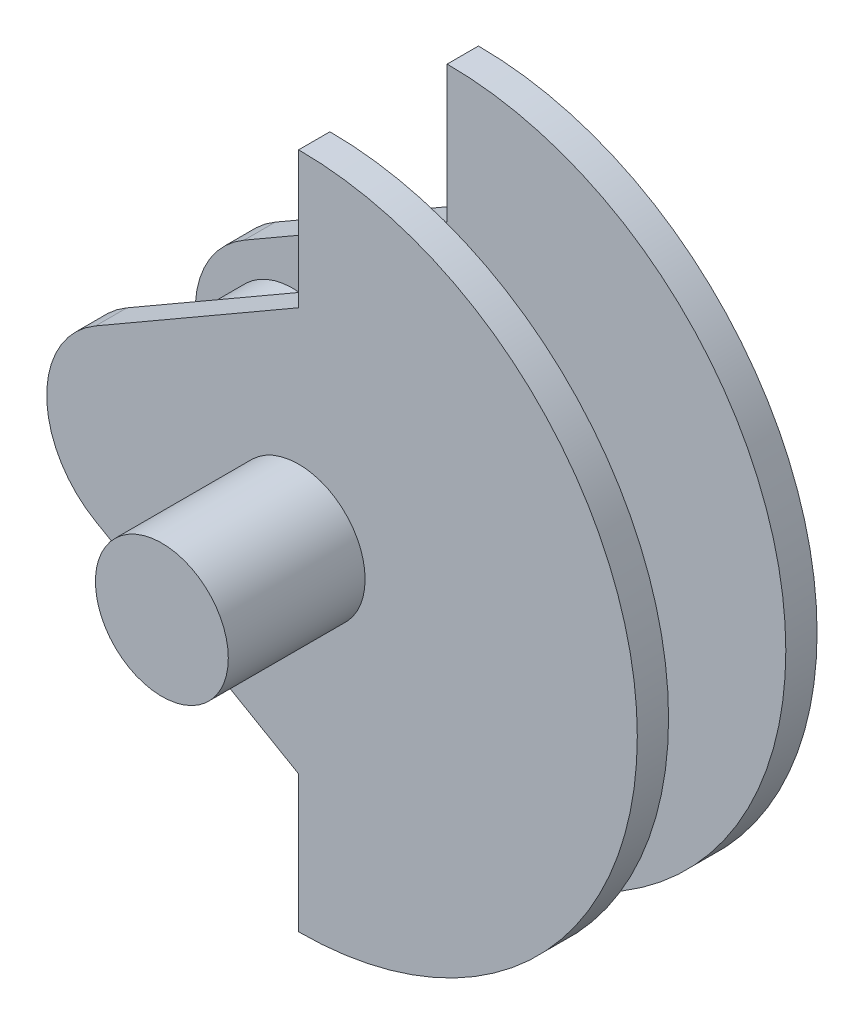
ISO-10303-21;
HEADER;
FILE_DESCRIPTION(('STEP AP214'),'2;1');
FILE_NAME('part.step','',(''),(''),'','','');
FILE_SCHEMA(('AUTOMOTIVE_DESIGN { 1 0 10303 214 1 1 1 1 }'));
ENDSEC;
DATA;
#1=APPLICATION_CONTEXT('core data for automotive mechanical design processes');
#2=APPLICATION_PROTOCOL_DEFINITION('international standard','automotive_design',2000,#1);
#3=PRODUCT_CONTEXT('',#1,'mechanical');
#4=PRODUCT('Part','Part','',(#3));
#5=PRODUCT_RELATED_PRODUCT_CATEGORY('part','',(#4));
#6=PRODUCT_DEFINITION_FORMATION('','',#4);
#7=PRODUCT_DEFINITION_CONTEXT('part definition',#1,'design');
#8=PRODUCT_DEFINITION('design','',#6,#7);
#9=PRODUCT_DEFINITION_SHAPE('','',#8);
#10=(LENGTH_UNIT() NAMED_UNIT(*) SI_UNIT(.MILLI.,.METRE.));
#11=(NAMED_UNIT(*) PLANE_ANGLE_UNIT() SI_UNIT($,.RADIAN.));
#12=(NAMED_UNIT(*) SI_UNIT($,.STERADIAN.) SOLID_ANGLE_UNIT());
#13=UNCERTAINTY_MEASURE_WITH_UNIT(LENGTH_MEASURE(1.E-05),#10,'distance_accuracy_value','');
#14=(GEOMETRIC_REPRESENTATION_CONTEXT(3) GLOBAL_UNCERTAINTY_ASSIGNED_CONTEXT((#13)) GLOBAL_UNIT_ASSIGNED_CONTEXT((#10,
#11,#12)) REPRESENTATION_CONTEXT('',''));
#15=CARTESIAN_POINT('',(0.,0.,0.));
#16=DIRECTION('',(0.,0.,1.));
#17=DIRECTION('',(1.,0.,0.));
#18=AXIS2_PLACEMENT_3D('',#15,#16,#17);
#19=CARTESIAN_POINT('',(0.,0.,8.));
#20=DIRECTION('',(0.,0.,-1.));
#21=DIRECTION('',(-1.,0.,0.));
#22=AXIS2_PLACEMENT_3D('',#19,#20,#21);
#23=CYLINDRICAL_SURFACE('',#22,25.);
#24=CARTESIAN_POINT('',(0.,0.,0.));
#25=DIRECTION('',(0.,0.,1.));
#26=DIRECTION('',(1.,0.,0.));
#27=AXIS2_PLACEMENT_3D('',#24,#25,#26);
#28=CIRCLE('',#27,25.);
#29=CARTESIAN_POINT('',(-12.5000000000001,21.6506350946109,0.));
#30=VERTEX_POINT('',#29);
#31=CARTESIAN_POINT('',(-12.5,-21.6506350946109,0.));
#32=VERTEX_POINT('',#31);
#33=EDGE_CURVE('E137',#30,#32,#28,.T.);
#34=ORIENTED_EDGE('',*,*,#33,.T.);
#35=DIRECTION('',(0.,0.,-1.));
#36=VECTOR('',#35,1.);
#37=CARTESIAN_POINT('',(-12.5,-21.6506350946109,8.));
#38=LINE('',#37,#36);
#39=CARTESIAN_POINT('',(-12.5,-21.6506350946109,8.));
#40=VERTEX_POINT('',#39);
#41=EDGE_CURVE('E51',#40,#32,#38,.T.);
#42=ORIENTED_EDGE('',*,*,#41,.F.);
#43=CARTESIAN_POINT('',(0.,0.,8.));
#44=DIRECTION('',(0.,0.,1.));
#45=DIRECTION('',(1.,0.,0.));
#46=AXIS2_PLACEMENT_3D('',#43,#44,#45);
#47=CIRCLE('',#46,25.);
#48=CARTESIAN_POINT('',(-12.5000000000001,21.6506350946109,8.));
#49=VERTEX_POINT('',#48);
#50=EDGE_CURVE('E153',#49,#40,#47,.T.);
#51=ORIENTED_EDGE('',*,*,#50,.F.);
#52=DIRECTION('',(0.,0.,-1.));
#53=VECTOR('',#52,1.);
#54=CARTESIAN_POINT('',(-12.5000000000001,21.6506350946109,8.));
#55=LINE('',#54,#53);
#56=EDGE_CURVE('E133',#49,#30,#55,.T.);
#57=ORIENTED_EDGE('',*,*,#56,.T.);
#58=EDGE_LOOP('',(#34,#42,#51,#57));
#59=FACE_BOUND('',#58,.T.);
#60=ADVANCED_FACE('F41',(#59),#23,.T.);
#61=CARTESIAN_POINT('',(-12.5,-21.6506350946109,8.));
#62=DIRECTION('',(0.500000000000001,0.866025403784438,0.));
#63=DIRECTION('',(-0.866025403784438,0.500000000000001,0.));
#64=AXIS2_PLACEMENT_3D('',#61,#62,#63);
#65=PLANE('',#64);
#66=DIRECTION('',(0.866025403784438,-0.500000000000001,0.));
#67=VECTOR('',#66,1.);
#68=CARTESIAN_POINT('',(-12.5,-21.6506350946109,0.));
#69=LINE('',#68,#67);
#70=CARTESIAN_POINT('',(39.4615242270662,-51.650635094611,0.));
#71=VERTEX_POINT('',#70);
#72=EDGE_CURVE('E141',#32,#71,#69,.T.);
#73=ORIENTED_EDGE('',*,*,#72,.T.);
#74=DIRECTION('',(0.,0.,-1.));
#75=VECTOR('',#74,1.);
#76=CARTESIAN_POINT('',(39.4615242270662,-51.650635094611,8.));
#77=LINE('',#76,#75);
#78=CARTESIAN_POINT('',(39.4615242270662,-51.650635094611,8.));
#79=VERTEX_POINT('',#78);
#80=EDGE_CURVE('E160',#79,#71,#77,.T.);
#81=ORIENTED_EDGE('',*,*,#80,.F.);
#82=DIRECTION('',(0.866025403784438,-0.500000000000001,0.));
#83=VECTOR('',#82,1.);
#84=CARTESIAN_POINT('',(-12.5,-21.6506350946109,8.));
#85=LINE('',#84,#83);
#86=EDGE_CURVE('E99',#40,#79,#85,.T.);
#87=ORIENTED_EDGE('',*,*,#86,.F.);
#88=ORIENTED_EDGE('',*,*,#41,.T.);
#89=EDGE_LOOP('',(#73,#81,#87,#88));
#90=FACE_BOUND('',#89,.T.);
#91=ADVANCED_FACE('F165',(#90),#65,.F.);
#92=CARTESIAN_POINT('',(39.4615242270662,-51.650635094611,8.));
#93=DIRECTION('',(1.,0.,0.));
#94=DIRECTION('',(0.,0.,-1.));
#95=AXIS2_PLACEMENT_3D('',#92,#93,#94);
#96=PLANE('',#95);
#97=DIRECTION('',(0.,-1.,0.));
#98=VECTOR('',#97,1.);
#99=CARTESIAN_POINT('',(39.4615242270662,-51.650635094611,0.));
#100=LINE('',#99,#98);
#101=CARTESIAN_POINT('',(39.4615242270662,-86.650635094611,0.));
#102=VERTEX_POINT('',#101);
#103=EDGE_CURVE('E144',#71,#102,#100,.T.);
#104=ORIENTED_EDGE('',*,*,#103,.T.);
#105=DIRECTION('',(0.,0.,-1.));
#106=VECTOR('',#105,1.);
#107=CARTESIAN_POINT('',(39.4615242270662,-86.650635094611,8.));
#108=LINE('',#107,#106);
#109=CARTESIAN_POINT('',(39.4615242270662,-86.650635094611,8.));
#110=VERTEX_POINT('',#109);
#111=EDGE_CURVE('E126',#110,#102,#108,.T.);
#112=ORIENTED_EDGE('',*,*,#111,.F.);
#113=DIRECTION('',(0.,-1.,0.));
#114=VECTOR('',#113,1.);
#115=CARTESIAN_POINT('',(39.4615242270662,-51.650635094611,8.));
#116=LINE('',#115,#114);
#117=EDGE_CURVE('E115',#79,#110,#116,.T.);
#118=ORIENTED_EDGE('',*,*,#117,.F.);
#119=ORIENTED_EDGE('',*,*,#80,.T.);
#120=EDGE_LOOP('',(#104,#112,#118,#119));
#121=FACE_BOUND('',#120,.T.);
#122=ADVANCED_FACE('F173',(#121),#96,.F.);
#123=CARTESIAN_POINT('',(39.4615242270662,0.,8.));
#124=DIRECTION('',(0.,0.,-1.));
#125=DIRECTION('',(-1.,0.,0.));
#126=AXIS2_PLACEMENT_3D('',#123,#124,#125);
#127=CYLINDRICAL_SURFACE('',#126,86.650635094611);
#128=CARTESIAN_POINT('',(39.4615242270662,0.,0.));
#129=DIRECTION('',(0.,0.,1.));
#130=DIRECTION('',(1.,0.,0.));
#131=AXIS2_PLACEMENT_3D('',#128,#129,#130);
#132=CIRCLE('',#131,86.650635094611);
#133=CARTESIAN_POINT('',(39.4615242270662,86.650635094611,0.));
#134=VERTEX_POINT('',#133);
#135=EDGE_CURVE('E124',#102,#134,#132,.T.);
#136=ORIENTED_EDGE('',*,*,#135,.T.);
#137=DIRECTION('',(0.,0.,-1.));
#138=VECTOR('',#137,1.);
#139=CARTESIAN_POINT('',(39.4615242270662,86.650635094611,8.));
#140=LINE('',#139,#138);
#141=CARTESIAN_POINT('',(39.4615242270662,86.650635094611,8.));
#142=VERTEX_POINT('',#141);
#143=EDGE_CURVE('E121',#142,#134,#140,.T.);
#144=ORIENTED_EDGE('',*,*,#143,.F.);
#145=CARTESIAN_POINT('',(39.4615242270662,0.,8.));
#146=DIRECTION('',(0.,0.,1.));
#147=DIRECTION('',(1.,0.,0.));
#148=AXIS2_PLACEMENT_3D('',#145,#146,#147);
#149=CIRCLE('',#148,86.650635094611);
#150=EDGE_CURVE('E109',#110,#142,#149,.T.);
#151=ORIENTED_EDGE('',*,*,#150,.F.);
#152=ORIENTED_EDGE('',*,*,#111,.T.);
#153=EDGE_LOOP('',(#136,#144,#151,#152));
#154=FACE_BOUND('',#153,.T.);
#155=ADVANCED_FACE('F122',(#154),#127,.T.);
#156=CARTESIAN_POINT('',(39.4615242270662,86.650635094611,8.));
#157=DIRECTION('',(1.,0.,0.));
#158=DIRECTION('',(0.,1.,0.));
#159=AXIS2_PLACEMENT_3D('',#156,#157,#158);
#160=PLANE('',#159);
#161=DIRECTION('',(0.,-1.,0.));
#162=VECTOR('',#161,1.);
#163=CARTESIAN_POINT('',(39.4615242270662,86.650635094611,0.));
#164=LINE('',#163,#162);
#165=CARTESIAN_POINT('',(39.4615242270662,51.650635094611,0.));
#166=VERTEX_POINT('',#165);
#167=EDGE_CURVE('E84',#134,#166,#164,.T.);
#168=ORIENTED_EDGE('',*,*,#167,.T.);
#169=DIRECTION('',(0.,0.,-1.));
#170=VECTOR('',#169,1.);
#171=CARTESIAN_POINT('',(39.4615242270662,51.650635094611,8.));
#172=LINE('',#171,#170);
#173=CARTESIAN_POINT('',(39.4615242270662,51.650635094611,8.));
#174=VERTEX_POINT('',#173);
#175=EDGE_CURVE('E127',#174,#166,#172,.T.);
#176=ORIENTED_EDGE('',*,*,#175,.F.);
#177=DIRECTION('',(0.,-1.,0.));
#178=VECTOR('',#177,1.);
#179=CARTESIAN_POINT('',(39.4615242270662,86.650635094611,8.));
#180=LINE('',#179,#178);
#181=EDGE_CURVE('E113',#142,#174,#180,.T.);
#182=ORIENTED_EDGE('',*,*,#181,.F.);
#183=ORIENTED_EDGE('',*,*,#143,.T.);
#184=EDGE_LOOP('',(#168,#176,#182,#183));
#185=FACE_BOUND('',#184,.T.);
#186=ADVANCED_FACE('F129',(#185),#160,.F.);
#187=CARTESIAN_POINT('',(-12.5000000000001,21.6506350946109,8.));
#188=DIRECTION('',(0.500000000000001,-0.866025403784438,0.));
#189=DIRECTION('',(0.866025403784438,0.500000000000001,0.));
#190=AXIS2_PLACEMENT_3D('',#187,#188,#189);
#191=PLANE('',#190);
#192=DIRECTION('',(-0.866025403784438,-0.500000000000001,0.));
#193=VECTOR('',#192,1.);
#194=CARTESIAN_POINT('',(-12.5000000000001,21.6506350946109,0.));
#195=LINE('',#194,#193);
#196=EDGE_CURVE('E90',#166,#30,#195,.T.);
#197=ORIENTED_EDGE('',*,*,#196,.T.);
#198=ORIENTED_EDGE('',*,*,#56,.F.);
#199=DIRECTION('',(-0.866025403784438,-0.500000000000001,0.));
#200=VECTOR('',#199,1.);
#201=CARTESIAN_POINT('',(-12.5000000000001,21.6506350946109,8.));
#202=LINE('',#201,#200);
#203=EDGE_CURVE('E60',#174,#49,#202,.T.);
#204=ORIENTED_EDGE('',*,*,#203,.F.);
#205=ORIENTED_EDGE('',*,*,#175,.T.);
#206=EDGE_LOOP('',(#197,#198,#204,#205));
#207=FACE_BOUND('',#206,.T.);
#208=ADVANCED_FACE('F341',(#207),#191,.F.);
#209=CARTESIAN_POINT('',(0.,0.,8.));
#210=DIRECTION('',(0.,0.,1.));
#211=DIRECTION('',(1.,0.,0.));
#212=AXIS2_PLACEMENT_3D('',#209,#210,#211);
#213=PLANE('',#212);
#214=CARTESIAN_POINT('',(39.4615242270662,0.,8.));
#215=DIRECTION('',(0.,0.,1.));
#216=DIRECTION('',(1.,0.,0.));
#217=AXIS2_PLACEMENT_3D('',#214,#215,#216);
#218=CIRCLE('',#217,17.);
#219=CARTESIAN_POINT('',(56.4615242270662,0.,8.));
#220=VERTEX_POINT('',#219);
#221=EDGE_CURVE('E11',#220,#220,#218,.T.);
#222=ORIENTED_EDGE('',*,*,#221,.F.);
#223=EDGE_LOOP('',(#222));
#224=FACE_BOUND('',#223,.T.);
#225=ORIENTED_EDGE('',*,*,#50,.T.);
#226=ORIENTED_EDGE('',*,*,#86,.T.);
#227=ORIENTED_EDGE('',*,*,#117,.T.);
#228=ORIENTED_EDGE('',*,*,#150,.T.);
#229=ORIENTED_EDGE('',*,*,#181,.T.);
#230=ORIENTED_EDGE('',*,*,#203,.T.);
#231=EDGE_LOOP('',(#225,#226,#227,#228,#229,#230));
#232=FACE_BOUND('',#231,.T.);
#233=ADVANCED_FACE('F111',(#224,#232),#213,.T.);
#234=CARTESIAN_POINT('',(0.,0.,0.));
#235=DIRECTION('',(0.,0.,1.));
#236=DIRECTION('',(1.,0.,0.));
#237=AXIS2_PLACEMENT_3D('',#234,#235,#236);
#238=PLANE('',#237);
#239=CARTESIAN_POINT('',(0.,0.,0.));
#240=DIRECTION('',(0.,0.,1.));
#241=DIRECTION('',(1.,0.,0.));
#242=AXIS2_PLACEMENT_3D('',#239,#240,#241);
#243=CIRCLE('',#242,17.2230362078055);
#244=CARTESIAN_POINT('',(17.2230362078055,0.,0.));
#245=VERTEX_POINT('',#244);
#246=EDGE_CURVE('E44',#245,#245,#243,.T.);
#247=ORIENTED_EDGE('',*,*,#246,.T.);
#248=EDGE_LOOP('',(#247));
#249=FACE_BOUND('',#248,.T.);
#250=ORIENTED_EDGE('',*,*,#33,.F.);
#251=ORIENTED_EDGE('',*,*,#196,.F.);
#252=ORIENTED_EDGE('',*,*,#167,.F.);
#253=ORIENTED_EDGE('',*,*,#135,.F.);
#254=ORIENTED_EDGE('',*,*,#103,.F.);
#255=ORIENTED_EDGE('',*,*,#72,.F.);
#256=EDGE_LOOP('',(#250,#251,#252,#253,#254,#255));
#257=FACE_BOUND('',#256,.T.);
#258=ADVANCED_FACE('F170',(#249,#257),#238,.F.);
#259=CARTESIAN_POINT('',(0.,0.,-30.));
#260=DIRECTION('',(0.,0.,1.));
#261=DIRECTION('',(1.,0.,0.));
#262=AXIS2_PLACEMENT_3D('',#259,#260,#261);
#263=CYLINDRICAL_SURFACE('',#262,17.2230362078055);
#264=CARTESIAN_POINT('',(0.,0.,-30.));
#265=DIRECTION('',(0.,0.,1.));
#266=DIRECTION('',(1.,0.,0.));
#267=AXIS2_PLACEMENT_3D('',#264,#265,#266);
#268=CIRCLE('',#267,17.2230362078055);
#269=CARTESIAN_POINT('',(17.2230362078055,0.,-30.));
#270=VERTEX_POINT('',#269);
#271=EDGE_CURVE('E180',#270,#270,#268,.T.);
#272=ORIENTED_EDGE('',*,*,#271,.T.);
#273=EDGE_LOOP('',(#272));
#274=FACE_BOUND('',#273,.T.);
#275=ORIENTED_EDGE('',*,*,#246,.F.);
#276=EDGE_LOOP('',(#275));
#277=FACE_BOUND('',#276,.T.);
#278=ADVANCED_FACE('F346',(#274,#277),#263,.T.);
#279=CARTESIAN_POINT('',(39.4615242270662,0.,-38.));
#280=DIRECTION('',(0.,0.,1.));
#281=DIRECTION('',(1.,0.,0.));
#282=AXIS2_PLACEMENT_3D('',#279,#280,#281);
#283=CYLINDRICAL_SURFACE('',#282,86.650635094611);
#284=CARTESIAN_POINT('',(39.4615242270662,0.,-30.));
#285=DIRECTION('',(0.,0.,-1.));
#286=DIRECTION('',(-1.,0.,0.));
#287=AXIS2_PLACEMENT_3D('',#284,#285,#286);
#288=CIRCLE('',#287,86.650635094611);
#289=CARTESIAN_POINT('',(39.4615242270662,86.650635094611,-30.));
#290=VERTEX_POINT('',#289);
#291=CARTESIAN_POINT('',(39.4615242270662,-86.650635094611,-30.));
#292=VERTEX_POINT('',#291);
#293=EDGE_CURVE('E230',#290,#292,#288,.T.);
#294=ORIENTED_EDGE('',*,*,#293,.T.);
#295=DIRECTION('',(0.,0.,1.));
#296=VECTOR('',#295,1.);
#297=CARTESIAN_POINT('',(39.4615242270662,-86.650635094611,-38.));
#298=LINE('',#297,#296);
#299=CARTESIAN_POINT('',(39.4615242270662,-86.650635094611,-38.));
#300=VERTEX_POINT('',#299);
#301=EDGE_CURVE('E184',#300,#292,#298,.T.);
#302=ORIENTED_EDGE('',*,*,#301,.F.);
#303=CARTESIAN_POINT('',(39.4615242270662,0.,-38.));
#304=DIRECTION('',(0.,0.,-1.));
#305=DIRECTION('',(-1.,0.,0.));
#306=AXIS2_PLACEMENT_3D('',#303,#304,#305);
#307=CIRCLE('',#306,86.650635094611);
#308=CARTESIAN_POINT('',(39.4615242270662,86.650635094611,-38.));
#309=VERTEX_POINT('',#308);
#310=EDGE_CURVE('E213',#309,#300,#307,.T.);
#311=ORIENTED_EDGE('',*,*,#310,.F.);
#312=DIRECTION('',(0.,0.,1.));
#313=VECTOR('',#312,1.);
#314=CARTESIAN_POINT('',(39.4615242270662,86.650635094611,-38.));
#315=LINE('',#314,#313);
#316=EDGE_CURVE('E204',#309,#290,#315,.T.);
#317=ORIENTED_EDGE('',*,*,#316,.T.);
#318=EDGE_LOOP('',(#294,#302,#311,#317));
#319=FACE_BOUND('',#318,.T.);
#320=ADVANCED_FACE('F294',(#319),#283,.T.);
#321=CARTESIAN_POINT('',(39.4615242270662,-51.650635094611,-38.));
#322=DIRECTION('',(1.,0.,0.));
#323=DIRECTION('',(0.,1.,0.));
#324=AXIS2_PLACEMENT_3D('',#321,#322,#323);
#325=PLANE('',#324);
#326=DIRECTION('',(0.,1.,0.));
#327=VECTOR('',#326,1.);
#328=CARTESIAN_POINT('',(39.4615242270662,-51.650635094611,-30.));
#329=LINE('',#328,#327);
#330=CARTESIAN_POINT('',(39.4615242270662,-51.650635094611,-30.));
#331=VERTEX_POINT('',#330);
#332=EDGE_CURVE('E226',#292,#331,#329,.T.);
#333=ORIENTED_EDGE('',*,*,#332,.T.);
#334=DIRECTION('',(0.,0.,1.));
#335=VECTOR('',#334,1.);
#336=CARTESIAN_POINT('',(39.4615242270662,-51.650635094611,-38.));
#337=LINE('',#336,#335);
#338=CARTESIAN_POINT('',(39.4615242270662,-51.650635094611,-38.));
#339=VERTEX_POINT('',#338);
#340=EDGE_CURVE('E188',#339,#331,#337,.T.);
#341=ORIENTED_EDGE('',*,*,#340,.F.);
#342=DIRECTION('',(0.,1.,0.));
#343=VECTOR('',#342,1.);
#344=CARTESIAN_POINT('',(39.4615242270662,-51.650635094611,-38.));
#345=LINE('',#344,#343);
#346=EDGE_CURVE('E250',#300,#339,#345,.T.);
#347=ORIENTED_EDGE('',*,*,#346,.F.);
#348=ORIENTED_EDGE('',*,*,#301,.T.);
#349=EDGE_LOOP('',(#333,#341,#347,#348));
#350=FACE_BOUND('',#349,.T.);
#351=ADVANCED_FACE('F298',(#350),#325,.F.);
#352=CARTESIAN_POINT('',(-12.5,-21.650635094611,-38.));
#353=DIRECTION('',(0.500000000000001,0.866025403784438,0.));
#354=DIRECTION('',(-0.866025403784438,0.500000000000001,0.));
#355=AXIS2_PLACEMENT_3D('',#352,#353,#354);
#356=PLANE('',#355);
#357=DIRECTION('',(-0.866025403784438,0.500000000000001,0.));
#358=VECTOR('',#357,1.);
#359=CARTESIAN_POINT('',(-12.5,-21.650635094611,-30.));
#360=LINE('',#359,#358);
#361=CARTESIAN_POINT('',(-12.5,-21.650635094611,-30.));
#362=VERTEX_POINT('',#361);
#363=EDGE_CURVE('E222',#331,#362,#360,.T.);
#364=ORIENTED_EDGE('',*,*,#363,.T.);
#365=DIRECTION('',(0.,0.,1.));
#366=VECTOR('',#365,1.);
#367=CARTESIAN_POINT('',(-12.5,-21.650635094611,-38.));
#368=LINE('',#367,#366);
#369=CARTESIAN_POINT('',(-12.5,-21.650635094611,-38.));
#370=VERTEX_POINT('',#369);
#371=EDGE_CURVE('E192',#370,#362,#368,.T.);
#372=ORIENTED_EDGE('',*,*,#371,.F.);
#373=DIRECTION('',(-0.866025403784438,0.500000000000001,0.));
#374=VECTOR('',#373,1.);
#375=CARTESIAN_POINT('',(-12.5,-21.650635094611,-38.));
#376=LINE('',#375,#374);
#377=EDGE_CURVE('E246',#339,#370,#376,.T.);
#378=ORIENTED_EDGE('',*,*,#377,.F.);
#379=ORIENTED_EDGE('',*,*,#340,.T.);
#380=EDGE_LOOP('',(#364,#372,#378,#379));
#381=FACE_BOUND('',#380,.T.);
#382=ADVANCED_FACE('F358',(#381),#356,.F.);
#383=CARTESIAN_POINT('',(0.,0.,-38.));
#384=DIRECTION('',(0.,0.,1.));
#385=DIRECTION('',(1.,0.,0.));
#386=AXIS2_PLACEMENT_3D('',#383,#384,#385);
#387=CYLINDRICAL_SURFACE('',#386,25.);
#388=CARTESIAN_POINT('',(0.,0.,-30.));
#389=DIRECTION('',(0.,0.,-1.));
#390=DIRECTION('',(-1.,0.,0.));
#391=AXIS2_PLACEMENT_3D('',#388,#389,#390);
#392=CIRCLE('',#391,25.);
#393=CARTESIAN_POINT('',(-12.5,21.6506350946109,-30.));
#394=VERTEX_POINT('',#393);
#395=EDGE_CURVE('E218',#362,#394,#392,.T.);
#396=ORIENTED_EDGE('',*,*,#395,.T.);
#397=DIRECTION('',(0.,0.,1.));
#398=VECTOR('',#397,1.);
#399=CARTESIAN_POINT('',(-12.5,21.6506350946109,-38.));
#400=LINE('',#399,#398);
#401=CARTESIAN_POINT('',(-12.5,21.6506350946109,-38.));
#402=VERTEX_POINT('',#401);
#403=EDGE_CURVE('E196',#402,#394,#400,.T.);
#404=ORIENTED_EDGE('',*,*,#403,.F.);
#405=CARTESIAN_POINT('',(0.,0.,-38.));
#406=DIRECTION('',(0.,0.,-1.));
#407=DIRECTION('',(-1.,0.,0.));
#408=AXIS2_PLACEMENT_3D('',#405,#406,#407);
#409=CIRCLE('',#408,25.);
#410=EDGE_CURVE('E242',#370,#402,#409,.T.);
#411=ORIENTED_EDGE('',*,*,#410,.F.);
#412=ORIENTED_EDGE('',*,*,#371,.T.);
#413=EDGE_LOOP('',(#396,#404,#411,#412));
#414=FACE_BOUND('',#413,.T.);
#415=ADVANCED_FACE('F361',(#414),#387,.T.);
#416=CARTESIAN_POINT('',(39.4615242270662,51.650635094611,-38.));
#417=DIRECTION('',(0.500000000000001,-0.866025403784438,0.));
#418=DIRECTION('',(0.866025403784438,0.500000000000001,0.));
#419=AXIS2_PLACEMENT_3D('',#416,#417,#418);
#420=PLANE('',#419);
#421=DIRECTION('',(0.866025403784438,0.500000000000001,0.));
#422=VECTOR('',#421,1.);
#423=CARTESIAN_POINT('',(39.4615242270662,51.650635094611,-30.));
#424=LINE('',#423,#422);
#425=CARTESIAN_POINT('',(39.4615242270662,51.650635094611,-30.));
#426=VERTEX_POINT('',#425);
#427=EDGE_CURVE('E214',#394,#426,#424,.T.);
#428=ORIENTED_EDGE('',*,*,#427,.T.);
#429=DIRECTION('',(0.,0.,1.));
#430=VECTOR('',#429,1.);
#431=CARTESIAN_POINT('',(39.4615242270662,51.650635094611,-38.));
#432=LINE('',#431,#430);
#433=CARTESIAN_POINT('',(39.4615242270662,51.650635094611,-38.));
#434=VERTEX_POINT('',#433);
#435=EDGE_CURVE('E200',#434,#426,#432,.T.);
#436=ORIENTED_EDGE('',*,*,#435,.F.);
#437=DIRECTION('',(0.866025403784438,0.500000000000001,0.));
#438=VECTOR('',#437,1.);
#439=CARTESIAN_POINT('',(39.4615242270662,51.650635094611,-38.));
#440=LINE('',#439,#438);
#441=EDGE_CURVE('E238',#402,#434,#440,.T.);
#442=ORIENTED_EDGE('',*,*,#441,.F.);
#443=ORIENTED_EDGE('',*,*,#403,.T.);
#444=EDGE_LOOP('',(#428,#436,#442,#443));
#445=FACE_BOUND('',#444,.T.);
#446=ADVANCED_FACE('F365',(#445),#420,.F.);
#447=CARTESIAN_POINT('',(39.4615242270662,86.650635094611,-38.));
#448=DIRECTION('',(1.,0.,0.));
#449=DIRECTION('',(0.,1.,0.));
#450=AXIS2_PLACEMENT_3D('',#447,#448,#449);
#451=PLANE('',#450);
#452=DIRECTION('',(0.,1.,0.));
#453=VECTOR('',#452,1.);
#454=CARTESIAN_POINT('',(39.4615242270662,86.650635094611,-30.));
#455=LINE('',#454,#453);
#456=EDGE_CURVE('E209',#426,#290,#455,.T.);
#457=ORIENTED_EDGE('',*,*,#456,.T.);
#458=ORIENTED_EDGE('',*,*,#316,.F.);
#459=DIRECTION('',(0.,1.,0.));
#460=VECTOR('',#459,1.);
#461=CARTESIAN_POINT('',(39.4615242270662,86.650635094611,-38.));
#462=LINE('',#461,#460);
#463=EDGE_CURVE('E208',#434,#309,#462,.T.);
#464=ORIENTED_EDGE('',*,*,#463,.F.);
#465=ORIENTED_EDGE('',*,*,#435,.T.);
#466=EDGE_LOOP('',(#457,#458,#464,#465));
#467=FACE_BOUND('',#466,.T.);
#468=ADVANCED_FACE('F282',(#467),#451,.F.);
#469=CARTESIAN_POINT('',(39.4615242270662,0.,-38.));
#470=DIRECTION('',(0.,0.,-1.));
#471=DIRECTION('',(-1.,0.,0.));
#472=AXIS2_PLACEMENT_3D('',#469,#470,#471);
#473=PLANE('',#472);
#474=CARTESIAN_POINT('',(39.4615242270662,0.,-38.));
#475=DIRECTION('',(0.,0.,-1.));
#476=DIRECTION('',(-1.,0.,0.));
#477=AXIS2_PLACEMENT_3D('',#474,#475,#476);
#478=CIRCLE('',#477,17.);
#479=CARTESIAN_POINT('',(22.4615242270662,0.,-38.));
#480=VERTEX_POINT('',#479);
#481=EDGE_CURVE('E261',#480,#480,#478,.T.);
#482=ORIENTED_EDGE('',*,*,#481,.F.);
#483=EDGE_LOOP('',(#482));
#484=FACE_BOUND('',#483,.T.);
#485=ORIENTED_EDGE('',*,*,#310,.T.);
#486=ORIENTED_EDGE('',*,*,#346,.T.);
#487=ORIENTED_EDGE('',*,*,#377,.T.);
#488=ORIENTED_EDGE('',*,*,#410,.T.);
#489=ORIENTED_EDGE('',*,*,#441,.T.);
#490=ORIENTED_EDGE('',*,*,#463,.T.);
#491=EDGE_LOOP('',(#485,#486,#487,#488,#489,#490));
#492=FACE_BOUND('',#491,.T.);
#493=ADVANCED_FACE('F278',(#484,#492),#473,.T.);
#494=CARTESIAN_POINT('',(39.4615242270662,0.,-30.));
#495=DIRECTION('',(0.,0.,-1.));
#496=DIRECTION('',(-1.,0.,0.));
#497=AXIS2_PLACEMENT_3D('',#494,#495,#496);
#498=PLANE('',#497);
#499=ORIENTED_EDGE('',*,*,#271,.F.);
#500=EDGE_LOOP('',(#499));
#501=FACE_BOUND('',#500,.T.);
#502=ORIENTED_EDGE('',*,*,#293,.F.);
#503=ORIENTED_EDGE('',*,*,#456,.F.);
#504=ORIENTED_EDGE('',*,*,#427,.F.);
#505=ORIENTED_EDGE('',*,*,#395,.F.);
#506=ORIENTED_EDGE('',*,*,#363,.F.);
#507=ORIENTED_EDGE('',*,*,#332,.F.);
#508=EDGE_LOOP('',(#502,#503,#504,#505,#506,#507));
#509=FACE_BOUND('',#508,.T.);
#510=ADVANCED_FACE('F281',(#501,#509),#498,.F.);
#511=CARTESIAN_POINT('',(39.4615242270662,0.,43.));
#512=DIRECTION('',(0.,0.,-1.));
#513=DIRECTION('',(-1.,0.,0.));
#514=AXIS2_PLACEMENT_3D('',#511,#512,#513);
#515=CYLINDRICAL_SURFACE('',#514,17.);
#516=CARTESIAN_POINT('',(39.4615242270662,0.,43.));
#517=DIRECTION('',(0.,0.,1.));
#518=DIRECTION('',(1.,0.,0.));
#519=AXIS2_PLACEMENT_3D('',#516,#517,#518);
#520=CIRCLE('',#519,17.);
#521=CARTESIAN_POINT('',(56.4615242270662,0.,43.));
#522=VERTEX_POINT('',#521);
#523=EDGE_CURVE('E234',#522,#522,#520,.T.);
#524=ORIENTED_EDGE('',*,*,#523,.F.);
#525=EDGE_LOOP('',(#524));
#526=FACE_BOUND('',#525,.T.);
#527=ORIENTED_EDGE('',*,*,#221,.T.);
#528=EDGE_LOOP('',(#527));
#529=FACE_BOUND('',#528,.T.);
#530=ADVANCED_FACE('F318',(#526,#529),#515,.T.);
#531=CARTESIAN_POINT('',(39.4615242270662,0.,43.));
#532=DIRECTION('',(0.,0.,1.));
#533=DIRECTION('',(1.,0.,0.));
#534=AXIS2_PLACEMENT_3D('',#531,#532,#533);
#535=PLANE('',#534);
#536=ORIENTED_EDGE('',*,*,#523,.T.);
#537=EDGE_LOOP('',(#536));
#538=FACE_BOUND('',#537,.T.);
#539=ADVANCED_FACE('F274',(#538),#535,.T.);
#540=CARTESIAN_POINT('',(39.4615242270662,0.,-73.));
#541=DIRECTION('',(0.,0.,1.));
#542=DIRECTION('',(1.,0.,0.));
#543=AXIS2_PLACEMENT_3D('',#540,#541,#542);
#544=CYLINDRICAL_SURFACE('',#543,17.);
#545=CARTESIAN_POINT('',(39.4615242270662,0.,-73.));
#546=DIRECTION('',(0.,0.,-1.));
#547=DIRECTION('',(-1.,0.,0.));
#548=AXIS2_PLACEMENT_3D('',#545,#546,#547);
#549=CIRCLE('',#548,17.);
#550=CARTESIAN_POINT('',(22.4615242270662,0.,-73.));
#551=VERTEX_POINT('',#550);
#552=EDGE_CURVE('E260',#551,#551,#549,.T.);
#553=ORIENTED_EDGE('',*,*,#552,.F.);
#554=EDGE_LOOP('',(#553));
#555=FACE_BOUND('',#554,.T.);
#556=ORIENTED_EDGE('',*,*,#481,.T.);
#557=EDGE_LOOP('',(#556));
#558=FACE_BOUND('',#557,.T.);
#559=ADVANCED_FACE('F271',(#555,#558),#544,.T.);
#560=CARTESIAN_POINT('',(39.4615242270662,0.,-73.));
#561=DIRECTION('',(0.,0.,-1.));
#562=DIRECTION('',(-1.,0.,0.));
#563=AXIS2_PLACEMENT_3D('',#560,#561,#562);
#564=PLANE('',#563);
#565=ORIENTED_EDGE('',*,*,#552,.T.);
#566=EDGE_LOOP('',(#565));
#567=FACE_BOUND('',#566,.T.);
#568=ADVANCED_FACE('F269',(#567),#564,.T.);
#569=CLOSED_SHELL('',(#60,#91,#122,#155,#186,#208,#233,#258,#278,#320,#351,#382,#415,#446,#468,
#493,#510,#530,#539,#559,#568));
#570=MANIFOLD_SOLID_BREP('B2',#569);
#571=ADVANCED_BREP_SHAPE_REPRESENTATION('',(#18,#570),#14);
#572=SHAPE_DEFINITION_REPRESENTATION(#9,#571);
ENDSEC;
END-ISO-10303-21;
